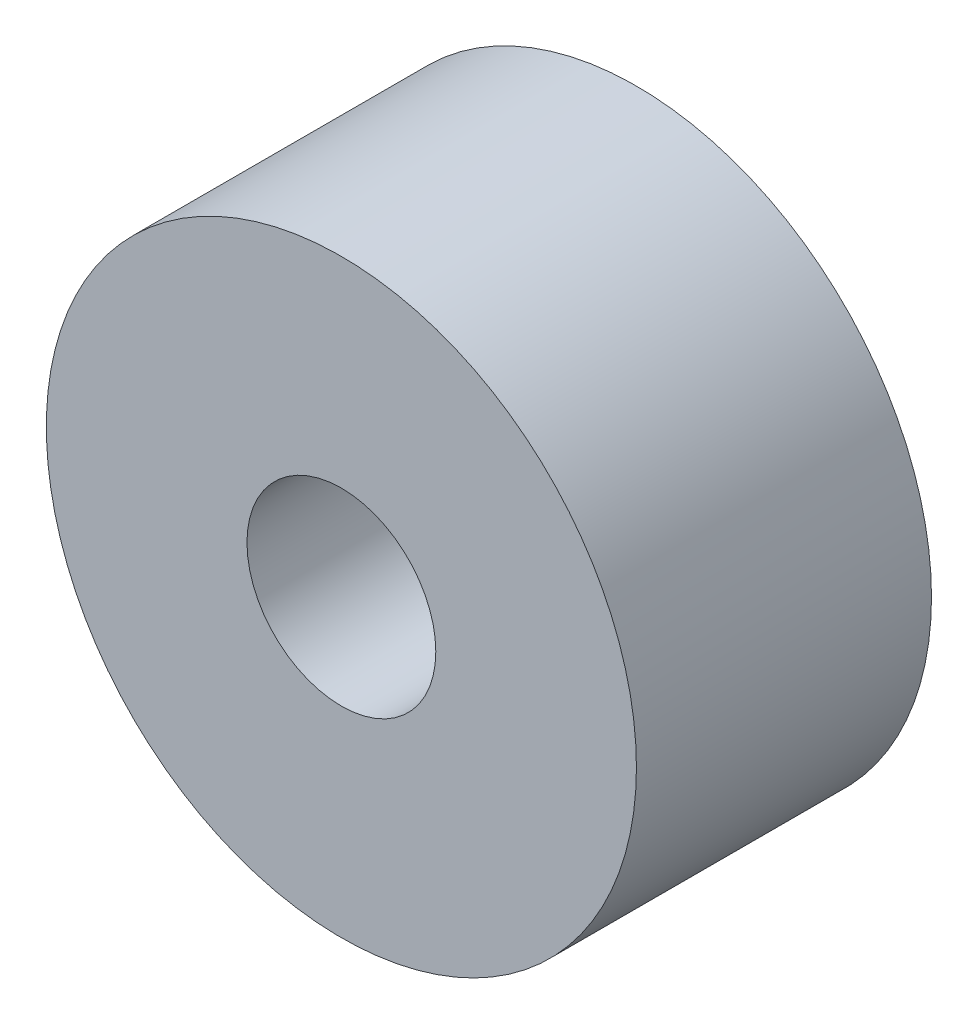
ISO-10303-21;
HEADER;
FILE_DESCRIPTION(('STEP AP214'),'2;1');
FILE_NAME('part.step','',(''),(''),'','','');
FILE_SCHEMA(('AUTOMOTIVE_DESIGN { 1 0 10303 214 1 1 1 1 }'));
ENDSEC;
DATA;
#1=APPLICATION_CONTEXT('core data for automotive mechanical design processes');
#2=APPLICATION_PROTOCOL_DEFINITION('international standard','automotive_design',2000,#1);
#3=PRODUCT_CONTEXT('',#1,'mechanical');
#4=PRODUCT('Part','Part','',(#3));
#5=PRODUCT_RELATED_PRODUCT_CATEGORY('part','',(#4));
#6=PRODUCT_DEFINITION_FORMATION('','',#4);
#7=PRODUCT_DEFINITION_CONTEXT('part definition',#1,'design');
#8=PRODUCT_DEFINITION('design','',#6,#7);
#9=PRODUCT_DEFINITION_SHAPE('','',#8);
#10=(LENGTH_UNIT() NAMED_UNIT(*) SI_UNIT(.MILLI.,.METRE.));
#11=(NAMED_UNIT(*) PLANE_ANGLE_UNIT() SI_UNIT($,.RADIAN.));
#12=(NAMED_UNIT(*) SI_UNIT($,.STERADIAN.) SOLID_ANGLE_UNIT());
#13=UNCERTAINTY_MEASURE_WITH_UNIT(LENGTH_MEASURE(1.E-05),#10,'distance_accuracy_value','');
#14=(GEOMETRIC_REPRESENTATION_CONTEXT(3) GLOBAL_UNCERTAINTY_ASSIGNED_CONTEXT((#13)) GLOBAL_UNIT_ASSIGNED_CONTEXT((#10,
#11,#12)) REPRESENTATION_CONTEXT('',''));
#15=CARTESIAN_POINT('',(0.,0.,0.));
#16=DIRECTION('',(0.,0.,1.));
#17=DIRECTION('',(1.,0.,0.));
#18=AXIS2_PLACEMENT_3D('',#15,#16,#17);
#19=CARTESIAN_POINT('',(0.,0.,5.));
#20=DIRECTION('',(0.,0.,1.));
#21=DIRECTION('',(1.,0.,0.));
#22=AXIS2_PLACEMENT_3D('',#19,#20,#21);
#23=PLANE('',#22);
#24=CARTESIAN_POINT('',(0.,0.,5.));
#25=DIRECTION('',(0.,0.,1.));
#26=DIRECTION('',(1.,0.,0.));
#27=AXIS2_PLACEMENT_3D('',#24,#25,#26);
#28=CIRCLE('',#27,5.);
#29=CARTESIAN_POINT('',(5.,0.,5.));
#30=VERTEX_POINT('',#29);
#31=EDGE_CURVE('E10',#30,#30,#28,.T.);
#32=ORIENTED_EDGE('',*,*,#31,.T.);
#33=EDGE_LOOP('',(#32));
#34=FACE_BOUND('',#33,.T.);
#35=CARTESIAN_POINT('',(0.,0.,5.));
#36=DIRECTION('',(0.,0.,1.));
#37=DIRECTION('',(1.,0.,0.));
#38=AXIS2_PLACEMENT_3D('',#35,#36,#37);
#39=CIRCLE('',#38,1.6);
#40=CARTESIAN_POINT('',(1.6,0.,5.));
#41=VERTEX_POINT('',#40);
#42=EDGE_CURVE('E45',#41,#41,#39,.T.);
#43=ORIENTED_EDGE('',*,*,#42,.F.);
#44=EDGE_LOOP('',(#43));
#45=FACE_BOUND('',#44,.T.);
#46=ADVANCED_FACE('F34',(#34,#45),#23,.T.);
#47=CARTESIAN_POINT('',(0.,0.,0.));
#48=DIRECTION('',(0.,0.,1.));
#49=DIRECTION('',(1.,0.,0.));
#50=AXIS2_PLACEMENT_3D('',#47,#48,#49);
#51=PLANE('',#50);
#52=CARTESIAN_POINT('',(0.,0.,0.));
#53=DIRECTION('',(0.,0.,1.));
#54=DIRECTION('',(1.,0.,0.));
#55=AXIS2_PLACEMENT_3D('',#52,#53,#54);
#56=CIRCLE('',#55,5.);
#57=CARTESIAN_POINT('',(5.,0.,0.));
#58=VERTEX_POINT('',#57);
#59=EDGE_CURVE('E38',#58,#58,#56,.T.);
#60=ORIENTED_EDGE('',*,*,#59,.F.);
#61=EDGE_LOOP('',(#60));
#62=FACE_BOUND('',#61,.T.);
#63=CARTESIAN_POINT('',(0.,0.,0.));
#64=DIRECTION('',(0.,0.,1.));
#65=DIRECTION('',(1.,0.,0.));
#66=AXIS2_PLACEMENT_3D('',#63,#64,#65);
#67=CIRCLE('',#66,1.6);
#68=CARTESIAN_POINT('',(1.6,0.,0.));
#69=VERTEX_POINT('',#68);
#70=EDGE_CURVE('E47',#69,#69,#67,.T.);
#71=ORIENTED_EDGE('',*,*,#70,.T.);
#72=EDGE_LOOP('',(#71));
#73=FACE_BOUND('',#72,.T.);
#74=ADVANCED_FACE('F57',(#62,#73),#51,.F.);
#75=CARTESIAN_POINT('',(0.,0.,5.));
#76=DIRECTION('',(0.,0.,-1.));
#77=DIRECTION('',(-1.,0.,0.));
#78=AXIS2_PLACEMENT_3D('',#75,#76,#77);
#79=CYLINDRICAL_SURFACE('',#78,5.);
#80=ORIENTED_EDGE('',*,*,#31,.F.);
#81=EDGE_LOOP('',(#80));
#82=FACE_BOUND('',#81,.T.);
#83=ORIENTED_EDGE('',*,*,#59,.T.);
#84=EDGE_LOOP('',(#83));
#85=FACE_BOUND('',#84,.T.);
#86=ADVANCED_FACE('F36',(#82,#85),#79,.T.);
#87=CARTESIAN_POINT('',(0.,0.,5.));
#88=DIRECTION('',(0.,0.,-1.));
#89=DIRECTION('',(-1.,0.,0.));
#90=AXIS2_PLACEMENT_3D('',#87,#88,#89);
#91=CYLINDRICAL_SURFACE('',#90,1.6);
#92=ORIENTED_EDGE('',*,*,#42,.T.);
#93=EDGE_LOOP('',(#92));
#94=FACE_BOUND('',#93,.T.);
#95=ORIENTED_EDGE('',*,*,#70,.F.);
#96=EDGE_LOOP('',(#95));
#97=FACE_BOUND('',#96,.T.);
#98=ADVANCED_FACE('F53',(#94,#97),#91,.F.);
#99=CLOSED_SHELL('',(#46,#74,#86,#98));
#100=MANIFOLD_SOLID_BREP('B2',#99);
#101=ADVANCED_BREP_SHAPE_REPRESENTATION('',(#18,#100),#14);
#102=SHAPE_DEFINITION_REPRESENTATION(#9,#101);
ENDSEC;
END-ISO-10303-21;
